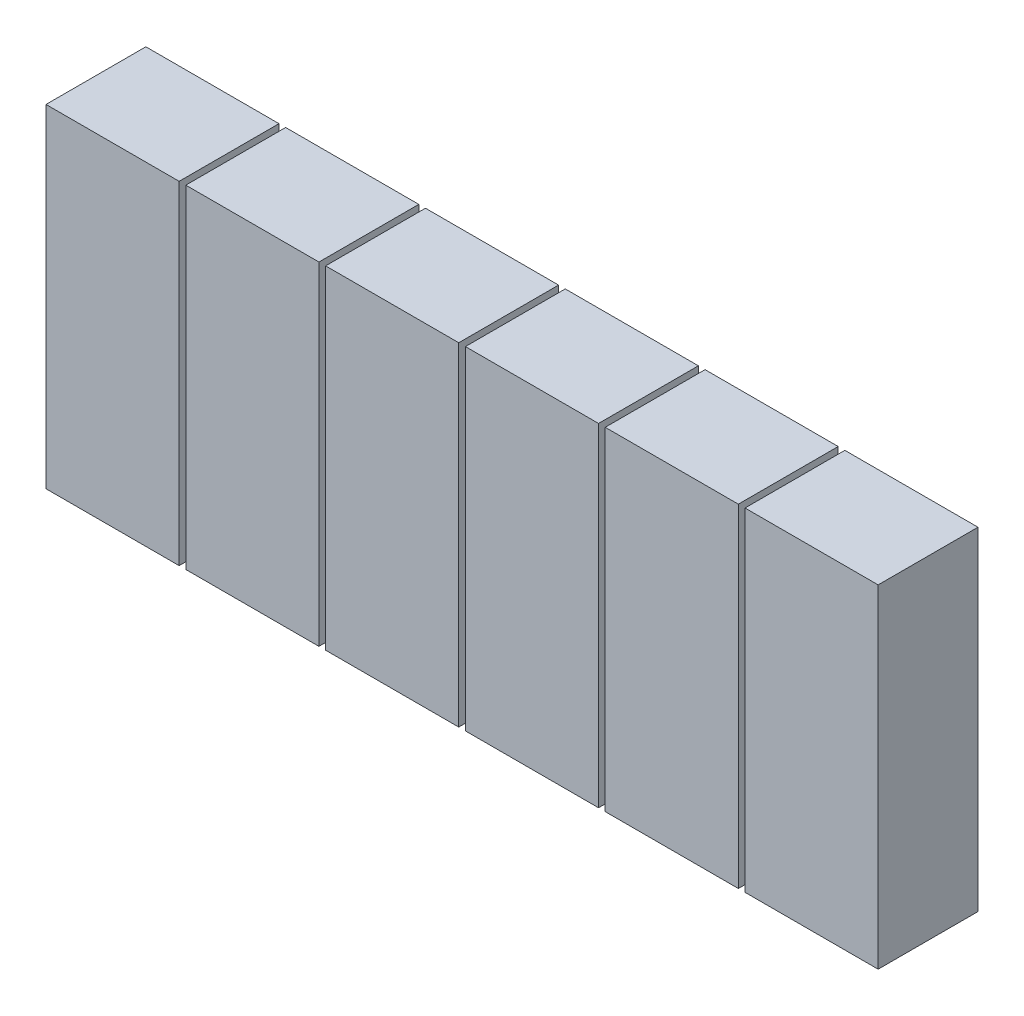
ISO-10303-21;
HEADER;
FILE_DESCRIPTION(('STEP AP214'),'2;1');
FILE_NAME('part.step','',(''),(''),'','','');
FILE_SCHEMA(('AUTOMOTIVE_DESIGN { 1 0 10303 214 1 1 1 1 }'));
ENDSEC;
DATA;
#1=APPLICATION_CONTEXT('core data for automotive mechanical design processes');
#2=APPLICATION_PROTOCOL_DEFINITION('international standard','automotive_design',2000,#1);
#3=PRODUCT_CONTEXT('',#1,'mechanical');
#4=PRODUCT('Part','Part','',(#3));
#5=PRODUCT_RELATED_PRODUCT_CATEGORY('part','',(#4));
#6=PRODUCT_DEFINITION_FORMATION('','',#4);
#7=PRODUCT_DEFINITION_CONTEXT('part definition',#1,'design');
#8=PRODUCT_DEFINITION('design','',#6,#7);
#9=PRODUCT_DEFINITION_SHAPE('','',#8);
#10=(LENGTH_UNIT() NAMED_UNIT(*) SI_UNIT(.MILLI.,.METRE.));
#11=(NAMED_UNIT(*) PLANE_ANGLE_UNIT() SI_UNIT($,.RADIAN.));
#12=(NAMED_UNIT(*) SI_UNIT($,.STERADIAN.) SOLID_ANGLE_UNIT());
#13=UNCERTAINTY_MEASURE_WITH_UNIT(LENGTH_MEASURE(1.E-05),#10,'distance_accuracy_value','');
#14=(GEOMETRIC_REPRESENTATION_CONTEXT(3) GLOBAL_UNCERTAINTY_ASSIGNED_CONTEXT((#13)) GLOBAL_UNIT_ASSIGNED_CONTEXT((#10,
#11,#12)) REPRESENTATION_CONTEXT('',''));
#15=CARTESIAN_POINT('',(0.,0.,0.));
#16=DIRECTION('',(0.,0.,1.));
#17=DIRECTION('',(1.,0.,0.));
#18=AXIS2_PLACEMENT_3D('',#15,#16,#17);
#19=CARTESIAN_POINT('',(9500.,-2500.,1500.));
#20=DIRECTION('',(0.,1.,0.));
#21=DIRECTION('',(0.,0.,1.));
#22=AXIS2_PLACEMENT_3D('',#19,#20,#21);
#23=PLANE('',#22);
#24=DIRECTION('',(1.,0.,0.));
#25=VECTOR('',#24,1.);
#26=CARTESIAN_POINT('',(9500.,-2500.,0.));
#27=LINE('',#26,#25);
#28=CARTESIAN_POINT('',(9500.,-2500.,0.));
#29=VERTEX_POINT('',#28);
#30=CARTESIAN_POINT('',(11500.,-2500.,0.));
#31=VERTEX_POINT('',#30);
#32=EDGE_CURVE('E113',#29,#31,#27,.T.);
#33=ORIENTED_EDGE('',*,*,#32,.T.);
#34=DIRECTION('',(0.,0.,-1.));
#35=VECTOR('',#34,1.);
#36=CARTESIAN_POINT('',(11500.,-2500.,1500.));
#37=LINE('',#36,#35);
#38=CARTESIAN_POINT('',(11500.,-2500.,1500.));
#39=VERTEX_POINT('',#38);
#40=EDGE_CURVE('E12',#39,#31,#37,.T.);
#41=ORIENTED_EDGE('',*,*,#40,.F.);
#42=DIRECTION('',(1.,0.,0.));
#43=VECTOR('',#42,1.);
#44=CARTESIAN_POINT('',(9500.,-2500.,1500.));
#45=LINE('',#44,#43);
#46=CARTESIAN_POINT('',(9500.,-2500.,1500.));
#47=VERTEX_POINT('',#46);
#48=EDGE_CURVE('E101',#47,#39,#45,.T.);
#49=ORIENTED_EDGE('',*,*,#48,.F.);
#50=DIRECTION('',(0.,0.,-1.));
#51=VECTOR('',#50,1.);
#52=CARTESIAN_POINT('',(9500.,-2500.,1500.));
#53=LINE('',#52,#51);
#54=EDGE_CURVE('E109',#47,#29,#53,.T.);
#55=ORIENTED_EDGE('',*,*,#54,.T.);
#56=EDGE_LOOP('',(#33,#41,#49,#55));
#57=FACE_BOUND('',#56,.T.);
#58=ADVANCED_FACE('F50',(#57),#23,.F.);
#59=CARTESIAN_POINT('',(11500.,2500.,1500.));
#60=DIRECTION('',(-1.,0.,0.));
#61=DIRECTION('',(0.,0.,1.));
#62=AXIS2_PLACEMENT_3D('',#59,#60,#61);
#63=PLANE('',#62);
#64=DIRECTION('',(0.,1.,0.));
#65=VECTOR('',#64,1.);
#66=CARTESIAN_POINT('',(11500.,2500.,0.));
#67=LINE('',#66,#65);
#68=CARTESIAN_POINT('',(11500.,2500.,0.));
#69=VERTEX_POINT('',#68);
#70=EDGE_CURVE('E105',#31,#69,#67,.T.);
#71=ORIENTED_EDGE('',*,*,#70,.T.);
#72=DIRECTION('',(0.,0.,-1.));
#73=VECTOR('',#72,1.);
#74=CARTESIAN_POINT('',(11500.,2500.,1500.));
#75=LINE('',#74,#73);
#76=CARTESIAN_POINT('',(11500.,2500.,1500.));
#77=VERTEX_POINT('',#76);
#78=EDGE_CURVE('E58',#77,#69,#75,.T.);
#79=ORIENTED_EDGE('',*,*,#78,.F.);
#80=DIRECTION('',(0.,1.,0.));
#81=VECTOR('',#80,1.);
#82=CARTESIAN_POINT('',(11500.,2500.,1500.));
#83=LINE('',#82,#81);
#84=EDGE_CURVE('E96',#39,#77,#83,.T.);
#85=ORIENTED_EDGE('',*,*,#84,.F.);
#86=ORIENTED_EDGE('',*,*,#40,.T.);
#87=EDGE_LOOP('',(#71,#79,#85,#86));
#88=FACE_BOUND('',#87,.T.);
#89=ADVANCED_FACE('F104',(#88),#63,.F.);
#90=CARTESIAN_POINT('',(9500.,2500.,1500.));
#91=DIRECTION('',(0.,-1.,0.));
#92=DIRECTION('',(0.,0.,-1.));
#93=AXIS2_PLACEMENT_3D('',#90,#91,#92);
#94=PLANE('',#93);
#95=DIRECTION('',(-1.,0.,0.));
#96=VECTOR('',#95,1.);
#97=CARTESIAN_POINT('',(9500.,2500.,0.));
#98=LINE('',#97,#96);
#99=CARTESIAN_POINT('',(9500.,2500.,0.));
#100=VERTEX_POINT('',#99);
#101=EDGE_CURVE('E83',#69,#100,#98,.T.);
#102=ORIENTED_EDGE('',*,*,#101,.T.);
#103=DIRECTION('',(0.,0.,-1.));
#104=VECTOR('',#103,1.);
#105=CARTESIAN_POINT('',(9500.,2500.,1500.));
#106=LINE('',#105,#104);
#107=CARTESIAN_POINT('',(9500.,2500.,1500.));
#108=VERTEX_POINT('',#107);
#109=EDGE_CURVE('E106',#108,#100,#106,.T.);
#110=ORIENTED_EDGE('',*,*,#109,.F.);
#111=DIRECTION('',(-1.,0.,0.));
#112=VECTOR('',#111,1.);
#113=CARTESIAN_POINT('',(9500.,2500.,1500.));
#114=LINE('',#113,#112);
#115=EDGE_CURVE('E99',#77,#108,#114,.T.);
#116=ORIENTED_EDGE('',*,*,#115,.F.);
#117=ORIENTED_EDGE('',*,*,#78,.T.);
#118=EDGE_LOOP('',(#102,#110,#116,#117));
#119=FACE_BOUND('',#118,.T.);
#120=ADVANCED_FACE('F107',(#119),#94,.F.);
#121=CARTESIAN_POINT('',(9500.,2500.,1500.));
#122=DIRECTION('',(1.,0.,0.));
#123=DIRECTION('',(0.,0.,-1.));
#124=AXIS2_PLACEMENT_3D('',#121,#122,#123);
#125=PLANE('',#124);
#126=DIRECTION('',(0.,-1.,0.));
#127=VECTOR('',#126,1.);
#128=CARTESIAN_POINT('',(9500.,2500.,0.));
#129=LINE('',#128,#127);
#130=EDGE_CURVE('E89',#100,#29,#129,.T.);
#131=ORIENTED_EDGE('',*,*,#130,.T.);
#132=ORIENTED_EDGE('',*,*,#54,.F.);
#133=DIRECTION('',(0.,-1.,0.));
#134=VECTOR('',#133,1.);
#135=CARTESIAN_POINT('',(9500.,2500.,1500.));
#136=LINE('',#135,#134);
#137=EDGE_CURVE('E66',#108,#47,#136,.T.);
#138=ORIENTED_EDGE('',*,*,#137,.F.);
#139=ORIENTED_EDGE('',*,*,#109,.T.);
#140=EDGE_LOOP('',(#131,#132,#138,#139));
#141=FACE_BOUND('',#140,.T.);
#142=ADVANCED_FACE('F120',(#141),#125,.F.);
#143=CARTESIAN_POINT('',(0.,0.,1500.));
#144=DIRECTION('',(0.,0.,-1.));
#145=DIRECTION('',(-1.,0.,0.));
#146=AXIS2_PLACEMENT_3D('',#143,#144,#145);
#147=PLANE('',#146);
#148=ORIENTED_EDGE('',*,*,#48,.T.);
#149=ORIENTED_EDGE('',*,*,#84,.T.);
#150=ORIENTED_EDGE('',*,*,#115,.T.);
#151=ORIENTED_EDGE('',*,*,#137,.T.);
#152=EDGE_LOOP('',(#148,#149,#150,#151));
#153=FACE_BOUND('',#152,.T.);
#154=ADVANCED_FACE('F97',(#153),#147,.F.);
#155=CARTESIAN_POINT('',(0.,0.,0.));
#156=DIRECTION('',(0.,0.,-1.));
#157=DIRECTION('',(-1.,0.,0.));
#158=AXIS2_PLACEMENT_3D('',#155,#156,#157);
#159=PLANE('',#158);
#160=ORIENTED_EDGE('',*,*,#32,.F.);
#161=ORIENTED_EDGE('',*,*,#130,.F.);
#162=ORIENTED_EDGE('',*,*,#101,.F.);
#163=ORIENTED_EDGE('',*,*,#70,.F.);
#164=EDGE_LOOP('',(#160,#161,#162,#163));
#165=FACE_BOUND('',#164,.T.);
#166=ADVANCED_FACE('F123',(#165),#159,.T.);
#167=CLOSED_SHELL('',(#58,#89,#120,#142,#154,#166));
#168=MANIFOLD_SOLID_BREP('B2',#167);
#169=CARTESIAN_POINT('',(7400.,-2500.,1500.));
#170=DIRECTION('',(0.,1.,0.));
#171=DIRECTION('',(0.,0.,1.));
#172=AXIS2_PLACEMENT_3D('',#169,#170,#171);
#173=PLANE('',#172);
#174=DIRECTION('',(1.,0.,0.));
#175=VECTOR('',#174,1.);
#176=CARTESIAN_POINT('',(7400.,-2500.,0.));
#177=LINE('',#176,#175);
#178=CARTESIAN_POINT('',(7400.,-2500.,0.));
#179=VERTEX_POINT('',#178);
#180=CARTESIAN_POINT('',(9400.,-2500.,0.));
#181=VERTEX_POINT('',#180);
#182=EDGE_CURVE('E247',#179,#181,#177,.T.);
#183=ORIENTED_EDGE('',*,*,#182,.T.);
#184=DIRECTION('',(0.,0.,-1.));
#185=VECTOR('',#184,1.);
#186=CARTESIAN_POINT('',(9400.,-2500.,1500.));
#187=LINE('',#186,#185);
#188=CARTESIAN_POINT('',(9400.,-2500.,1500.));
#189=VERTEX_POINT('',#188);
#190=EDGE_CURVE('E48',#189,#181,#187,.T.);
#191=ORIENTED_EDGE('',*,*,#190,.F.);
#192=DIRECTION('',(1.,0.,0.));
#193=VECTOR('',#192,1.);
#194=CARTESIAN_POINT('',(7400.,-2500.,1500.));
#195=LINE('',#194,#193);
#196=CARTESIAN_POINT('',(7400.,-2500.,1500.));
#197=VERTEX_POINT('',#196);
#198=EDGE_CURVE('E235',#197,#189,#195,.T.);
#199=ORIENTED_EDGE('',*,*,#198,.F.);
#200=DIRECTION('',(0.,0.,-1.));
#201=VECTOR('',#200,1.);
#202=CARTESIAN_POINT('',(7400.,-2500.,1500.));
#203=LINE('',#202,#201);
#204=EDGE_CURVE('E243',#197,#179,#203,.T.);
#205=ORIENTED_EDGE('',*,*,#204,.T.);
#206=EDGE_LOOP('',(#183,#191,#199,#205));
#207=FACE_BOUND('',#206,.T.);
#208=ADVANCED_FACE('F184',(#207),#173,.F.);
#209=CARTESIAN_POINT('',(9400.,2500.,1500.));
#210=DIRECTION('',(-1.,0.,0.));
#211=DIRECTION('',(0.,0.,1.));
#212=AXIS2_PLACEMENT_3D('',#209,#210,#211);
#213=PLANE('',#212);
#214=DIRECTION('',(0.,1.,0.));
#215=VECTOR('',#214,1.);
#216=CARTESIAN_POINT('',(9400.,2500.,0.));
#217=LINE('',#216,#215);
#218=CARTESIAN_POINT('',(9400.,2500.,0.));
#219=VERTEX_POINT('',#218);
#220=EDGE_CURVE('E239',#181,#219,#217,.T.);
#221=ORIENTED_EDGE('',*,*,#220,.T.);
#222=DIRECTION('',(0.,0.,-1.));
#223=VECTOR('',#222,1.);
#224=CARTESIAN_POINT('',(9400.,2500.,1500.));
#225=LINE('',#224,#223);
#226=CARTESIAN_POINT('',(9400.,2500.,1500.));
#227=VERTEX_POINT('',#226);
#228=EDGE_CURVE('E192',#227,#219,#225,.T.);
#229=ORIENTED_EDGE('',*,*,#228,.F.);
#230=DIRECTION('',(0.,1.,0.));
#231=VECTOR('',#230,1.);
#232=CARTESIAN_POINT('',(9400.,2500.,1500.));
#233=LINE('',#232,#231);
#234=EDGE_CURVE('E230',#189,#227,#233,.T.);
#235=ORIENTED_EDGE('',*,*,#234,.F.);
#236=ORIENTED_EDGE('',*,*,#190,.T.);
#237=EDGE_LOOP('',(#221,#229,#235,#236));
#238=FACE_BOUND('',#237,.T.);
#239=ADVANCED_FACE('F238',(#238),#213,.F.);
#240=CARTESIAN_POINT('',(7400.,2500.,1500.));
#241=DIRECTION('',(0.,-1.,0.));
#242=DIRECTION('',(0.,0.,-1.));
#243=AXIS2_PLACEMENT_3D('',#240,#241,#242);
#244=PLANE('',#243);
#245=DIRECTION('',(-1.,0.,0.));
#246=VECTOR('',#245,1.);
#247=CARTESIAN_POINT('',(7400.,2500.,0.));
#248=LINE('',#247,#246);
#249=CARTESIAN_POINT('',(7400.,2500.,0.));
#250=VERTEX_POINT('',#249);
#251=EDGE_CURVE('E217',#219,#250,#248,.T.);
#252=ORIENTED_EDGE('',*,*,#251,.T.);
#253=DIRECTION('',(0.,0.,-1.));
#254=VECTOR('',#253,1.);
#255=CARTESIAN_POINT('',(7400.,2500.,1500.));
#256=LINE('',#255,#254);
#257=CARTESIAN_POINT('',(7400.,2500.,1500.));
#258=VERTEX_POINT('',#257);
#259=EDGE_CURVE('E240',#258,#250,#256,.T.);
#260=ORIENTED_EDGE('',*,*,#259,.F.);
#261=DIRECTION('',(-1.,0.,0.));
#262=VECTOR('',#261,1.);
#263=CARTESIAN_POINT('',(7400.,2500.,1500.));
#264=LINE('',#263,#262);
#265=EDGE_CURVE('E233',#227,#258,#264,.T.);
#266=ORIENTED_EDGE('',*,*,#265,.F.);
#267=ORIENTED_EDGE('',*,*,#228,.T.);
#268=EDGE_LOOP('',(#252,#260,#266,#267));
#269=FACE_BOUND('',#268,.T.);
#270=ADVANCED_FACE('F241',(#269),#244,.F.);
#271=CARTESIAN_POINT('',(7400.,2500.,1500.));
#272=DIRECTION('',(1.,0.,0.));
#273=DIRECTION('',(0.,1.,0.));
#274=AXIS2_PLACEMENT_3D('',#271,#272,#273);
#275=PLANE('',#274);
#276=DIRECTION('',(0.,-1.,0.));
#277=VECTOR('',#276,1.);
#278=CARTESIAN_POINT('',(7400.,2500.,0.));
#279=LINE('',#278,#277);
#280=EDGE_CURVE('E223',#250,#179,#279,.T.);
#281=ORIENTED_EDGE('',*,*,#280,.T.);
#282=ORIENTED_EDGE('',*,*,#204,.F.);
#283=DIRECTION('',(0.,-1.,0.));
#284=VECTOR('',#283,1.);
#285=CARTESIAN_POINT('',(7400.,2500.,1500.));
#286=LINE('',#285,#284);
#287=EDGE_CURVE('E200',#258,#197,#286,.T.);
#288=ORIENTED_EDGE('',*,*,#287,.F.);
#289=ORIENTED_EDGE('',*,*,#259,.T.);
#290=EDGE_LOOP('',(#281,#282,#288,#289));
#291=FACE_BOUND('',#290,.T.);
#292=ADVANCED_FACE('F254',(#291),#275,.F.);
#293=CARTESIAN_POINT('',(0.,0.,1500.));
#294=DIRECTION('',(0.,0.,-1.));
#295=DIRECTION('',(-1.,0.,0.));
#296=AXIS2_PLACEMENT_3D('',#293,#294,#295);
#297=PLANE('',#296);
#298=ORIENTED_EDGE('',*,*,#198,.T.);
#299=ORIENTED_EDGE('',*,*,#234,.T.);
#300=ORIENTED_EDGE('',*,*,#265,.T.);
#301=ORIENTED_EDGE('',*,*,#287,.T.);
#302=EDGE_LOOP('',(#298,#299,#300,#301));
#303=FACE_BOUND('',#302,.T.);
#304=ADVANCED_FACE('F231',(#303),#297,.F.);
#305=CARTESIAN_POINT('',(0.,0.,0.));
#306=DIRECTION('',(0.,0.,-1.));
#307=DIRECTION('',(-1.,0.,0.));
#308=AXIS2_PLACEMENT_3D('',#305,#306,#307);
#309=PLANE('',#308);
#310=ORIENTED_EDGE('',*,*,#182,.F.);
#311=ORIENTED_EDGE('',*,*,#280,.F.);
#312=ORIENTED_EDGE('',*,*,#251,.F.);
#313=ORIENTED_EDGE('',*,*,#220,.F.);
#314=EDGE_LOOP('',(#310,#311,#312,#313));
#315=FACE_BOUND('',#314,.T.);
#316=ADVANCED_FACE('F257',(#315),#309,.T.);
#317=CLOSED_SHELL('',(#208,#239,#270,#292,#304,#316));
#318=MANIFOLD_SOLID_BREP('B6',#317);
#319=CARTESIAN_POINT('',(5300.,-2500.,1500.));
#320=DIRECTION('',(0.,1.,0.));
#321=DIRECTION('',(0.,0.,1.));
#322=AXIS2_PLACEMENT_3D('',#319,#320,#321);
#323=PLANE('',#322);
#324=DIRECTION('',(1.,0.,0.));
#325=VECTOR('',#324,1.);
#326=CARTESIAN_POINT('',(5300.,-2500.,0.));
#327=LINE('',#326,#325);
#328=CARTESIAN_POINT('',(5300.,-2500.,0.));
#329=VERTEX_POINT('',#328);
#330=CARTESIAN_POINT('',(7300.,-2500.,0.));
#331=VERTEX_POINT('',#330);
#332=EDGE_CURVE('E381',#329,#331,#327,.T.);
#333=ORIENTED_EDGE('',*,*,#332,.T.);
#334=DIRECTION('',(0.,0.,-1.));
#335=VECTOR('',#334,1.);
#336=CARTESIAN_POINT('',(7300.,-2500.,1500.));
#337=LINE('',#336,#335);
#338=CARTESIAN_POINT('',(7300.,-2500.,1500.));
#339=VERTEX_POINT('',#338);
#340=EDGE_CURVE('E182',#339,#331,#337,.T.);
#341=ORIENTED_EDGE('',*,*,#340,.F.);
#342=DIRECTION('',(1.,0.,0.));
#343=VECTOR('',#342,1.);
#344=CARTESIAN_POINT('',(5300.,-2500.,1500.));
#345=LINE('',#344,#343);
#346=CARTESIAN_POINT('',(5300.,-2500.,1500.));
#347=VERTEX_POINT('',#346);
#348=EDGE_CURVE('E369',#347,#339,#345,.T.);
#349=ORIENTED_EDGE('',*,*,#348,.F.);
#350=DIRECTION('',(0.,0.,-1.));
#351=VECTOR('',#350,1.);
#352=CARTESIAN_POINT('',(5300.,-2500.,1500.));
#353=LINE('',#352,#351);
#354=EDGE_CURVE('E377',#347,#329,#353,.T.);
#355=ORIENTED_EDGE('',*,*,#354,.T.);
#356=EDGE_LOOP('',(#333,#341,#349,#355));
#357=FACE_BOUND('',#356,.T.);
#358=ADVANCED_FACE('F318',(#357),#323,.F.);
#359=CARTESIAN_POINT('',(7300.,2500.,1500.));
#360=DIRECTION('',(-1.,0.,0.));
#361=DIRECTION('',(0.,0.,1.));
#362=AXIS2_PLACEMENT_3D('',#359,#360,#361);
#363=PLANE('',#362);
#364=DIRECTION('',(0.,1.,0.));
#365=VECTOR('',#364,1.);
#366=CARTESIAN_POINT('',(7300.,2500.,0.));
#367=LINE('',#366,#365);
#368=CARTESIAN_POINT('',(7300.,2500.,0.));
#369=VERTEX_POINT('',#368);
#370=EDGE_CURVE('E373',#331,#369,#367,.T.);
#371=ORIENTED_EDGE('',*,*,#370,.T.);
#372=DIRECTION('',(0.,0.,-1.));
#373=VECTOR('',#372,1.);
#374=CARTESIAN_POINT('',(7300.,2500.,1500.));
#375=LINE('',#374,#373);
#376=CARTESIAN_POINT('',(7300.,2500.,1500.));
#377=VERTEX_POINT('',#376);
#378=EDGE_CURVE('E326',#377,#369,#375,.T.);
#379=ORIENTED_EDGE('',*,*,#378,.F.);
#380=DIRECTION('',(0.,1.,0.));
#381=VECTOR('',#380,1.);
#382=CARTESIAN_POINT('',(7300.,2500.,1500.));
#383=LINE('',#382,#381);
#384=EDGE_CURVE('E364',#339,#377,#383,.T.);
#385=ORIENTED_EDGE('',*,*,#384,.F.);
#386=ORIENTED_EDGE('',*,*,#340,.T.);
#387=EDGE_LOOP('',(#371,#379,#385,#386));
#388=FACE_BOUND('',#387,.T.);
#389=ADVANCED_FACE('F372',(#388),#363,.F.);
#390=CARTESIAN_POINT('',(5300.,2500.,1500.));
#391=DIRECTION('',(0.,-1.,0.));
#392=DIRECTION('',(0.,0.,-1.));
#393=AXIS2_PLACEMENT_3D('',#390,#391,#392);
#394=PLANE('',#393);
#395=DIRECTION('',(-1.,0.,0.));
#396=VECTOR('',#395,1.);
#397=CARTESIAN_POINT('',(5300.,2500.,0.));
#398=LINE('',#397,#396);
#399=CARTESIAN_POINT('',(5300.,2500.,0.));
#400=VERTEX_POINT('',#399);
#401=EDGE_CURVE('E351',#369,#400,#398,.T.);
#402=ORIENTED_EDGE('',*,*,#401,.T.);
#403=DIRECTION('',(0.,0.,-1.));
#404=VECTOR('',#403,1.);
#405=CARTESIAN_POINT('',(5300.,2500.,1500.));
#406=LINE('',#405,#404);
#407=CARTESIAN_POINT('',(5300.,2500.,1500.));
#408=VERTEX_POINT('',#407);
#409=EDGE_CURVE('E374',#408,#400,#406,.T.);
#410=ORIENTED_EDGE('',*,*,#409,.F.);
#411=DIRECTION('',(-1.,0.,0.));
#412=VECTOR('',#411,1.);
#413=CARTESIAN_POINT('',(5300.,2500.,1500.));
#414=LINE('',#413,#412);
#415=EDGE_CURVE('E367',#377,#408,#414,.T.);
#416=ORIENTED_EDGE('',*,*,#415,.F.);
#417=ORIENTED_EDGE('',*,*,#378,.T.);
#418=EDGE_LOOP('',(#402,#410,#416,#417));
#419=FACE_BOUND('',#418,.T.);
#420=ADVANCED_FACE('F375',(#419),#394,.F.);
#421=CARTESIAN_POINT('',(5300.,2500.,1500.));
#422=DIRECTION('',(1.,0.,0.));
#423=DIRECTION('',(0.,1.,0.));
#424=AXIS2_PLACEMENT_3D('',#421,#422,#423);
#425=PLANE('',#424);
#426=DIRECTION('',(0.,-1.,0.));
#427=VECTOR('',#426,1.);
#428=CARTESIAN_POINT('',(5300.,2500.,0.));
#429=LINE('',#428,#427);
#430=EDGE_CURVE('E357',#400,#329,#429,.T.);
#431=ORIENTED_EDGE('',*,*,#430,.T.);
#432=ORIENTED_EDGE('',*,*,#354,.F.);
#433=DIRECTION('',(0.,-1.,0.));
#434=VECTOR('',#433,1.);
#435=CARTESIAN_POINT('',(5300.,2500.,1500.));
#436=LINE('',#435,#434);
#437=EDGE_CURVE('E334',#408,#347,#436,.T.);
#438=ORIENTED_EDGE('',*,*,#437,.F.);
#439=ORIENTED_EDGE('',*,*,#409,.T.);
#440=EDGE_LOOP('',(#431,#432,#438,#439));
#441=FACE_BOUND('',#440,.T.);
#442=ADVANCED_FACE('F388',(#441),#425,.F.);
#443=CARTESIAN_POINT('',(0.,0.,1500.));
#444=DIRECTION('',(0.,0.,-1.));
#445=DIRECTION('',(-1.,0.,0.));
#446=AXIS2_PLACEMENT_3D('',#443,#444,#445);
#447=PLANE('',#446);
#448=ORIENTED_EDGE('',*,*,#348,.T.);
#449=ORIENTED_EDGE('',*,*,#384,.T.);
#450=ORIENTED_EDGE('',*,*,#415,.T.);
#451=ORIENTED_EDGE('',*,*,#437,.T.);
#452=EDGE_LOOP('',(#448,#449,#450,#451));
#453=FACE_BOUND('',#452,.T.);
#454=ADVANCED_FACE('F365',(#453),#447,.F.);
#455=CARTESIAN_POINT('',(0.,0.,0.));
#456=DIRECTION('',(0.,0.,-1.));
#457=DIRECTION('',(-1.,0.,0.));
#458=AXIS2_PLACEMENT_3D('',#455,#456,#457);
#459=PLANE('',#458);
#460=ORIENTED_EDGE('',*,*,#332,.F.);
#461=ORIENTED_EDGE('',*,*,#430,.F.);
#462=ORIENTED_EDGE('',*,*,#401,.F.);
#463=ORIENTED_EDGE('',*,*,#370,.F.);
#464=EDGE_LOOP('',(#460,#461,#462,#463));
#465=FACE_BOUND('',#464,.T.);
#466=ADVANCED_FACE('F391',(#465),#459,.T.);
#467=CLOSED_SHELL('',(#358,#389,#420,#442,#454,#466));
#468=MANIFOLD_SOLID_BREP('B42',#467);
#469=CARTESIAN_POINT('',(3200.,-2500.,1500.));
#470=DIRECTION('',(0.,1.,0.));
#471=DIRECTION('',(0.,0.,1.));
#472=AXIS2_PLACEMENT_3D('',#469,#470,#471);
#473=PLANE('',#472);
#474=DIRECTION('',(1.,0.,0.));
#475=VECTOR('',#474,1.);
#476=CARTESIAN_POINT('',(3200.,-2500.,0.));
#477=LINE('',#476,#475);
#478=CARTESIAN_POINT('',(3200.,-2500.,0.));
#479=VERTEX_POINT('',#478);
#480=CARTESIAN_POINT('',(5200.,-2500.,0.));
#481=VERTEX_POINT('',#480);
#482=EDGE_CURVE('E515',#479,#481,#477,.T.);
#483=ORIENTED_EDGE('',*,*,#482,.T.);
#484=DIRECTION('',(0.,0.,-1.));
#485=VECTOR('',#484,1.);
#486=CARTESIAN_POINT('',(5200.,-2500.,1500.));
#487=LINE('',#486,#485);
#488=CARTESIAN_POINT('',(5200.,-2500.,1500.));
#489=VERTEX_POINT('',#488);
#490=EDGE_CURVE('E316',#489,#481,#487,.T.);
#491=ORIENTED_EDGE('',*,*,#490,.F.);
#492=DIRECTION('',(1.,0.,0.));
#493=VECTOR('',#492,1.);
#494=CARTESIAN_POINT('',(3200.,-2500.,1500.));
#495=LINE('',#494,#493);
#496=CARTESIAN_POINT('',(3200.,-2500.,1500.));
#497=VERTEX_POINT('',#496);
#498=EDGE_CURVE('E503',#497,#489,#495,.T.);
#499=ORIENTED_EDGE('',*,*,#498,.F.);
#500=DIRECTION('',(0.,0.,-1.));
#501=VECTOR('',#500,1.);
#502=CARTESIAN_POINT('',(3200.,-2500.,1500.));
#503=LINE('',#502,#501);
#504=EDGE_CURVE('E511',#497,#479,#503,.T.);
#505=ORIENTED_EDGE('',*,*,#504,.T.);
#506=EDGE_LOOP('',(#483,#491,#499,#505));
#507=FACE_BOUND('',#506,.T.);
#508=ADVANCED_FACE('F452',(#507),#473,.F.);
#509=CARTESIAN_POINT('',(5200.,2500.,1500.));
#510=DIRECTION('',(-1.,0.,0.));
#511=DIRECTION('',(0.,-1.,0.));
#512=AXIS2_PLACEMENT_3D('',#509,#510,#511);
#513=PLANE('',#512);
#514=DIRECTION('',(0.,1.,0.));
#515=VECTOR('',#514,1.);
#516=CARTESIAN_POINT('',(5200.,2500.,0.));
#517=LINE('',#516,#515);
#518=CARTESIAN_POINT('',(5200.,2500.,0.));
#519=VERTEX_POINT('',#518);
#520=EDGE_CURVE('E507',#481,#519,#517,.T.);
#521=ORIENTED_EDGE('',*,*,#520,.T.);
#522=DIRECTION('',(0.,0.,-1.));
#523=VECTOR('',#522,1.);
#524=CARTESIAN_POINT('',(5200.,2500.,1500.));
#525=LINE('',#524,#523);
#526=CARTESIAN_POINT('',(5200.,2500.,1500.));
#527=VERTEX_POINT('',#526);
#528=EDGE_CURVE('E460',#527,#519,#525,.T.);
#529=ORIENTED_EDGE('',*,*,#528,.F.);
#530=DIRECTION('',(0.,1.,0.));
#531=VECTOR('',#530,1.);
#532=CARTESIAN_POINT('',(5200.,2500.,1500.));
#533=LINE('',#532,#531);
#534=EDGE_CURVE('E498',#489,#527,#533,.T.);
#535=ORIENTED_EDGE('',*,*,#534,.F.);
#536=ORIENTED_EDGE('',*,*,#490,.T.);
#537=EDGE_LOOP('',(#521,#529,#535,#536));
#538=FACE_BOUND('',#537,.T.);
#539=ADVANCED_FACE('F506',(#538),#513,.F.);
#540=CARTESIAN_POINT('',(3200.,2500.,1500.));
#541=DIRECTION('',(0.,-1.,0.));
#542=DIRECTION('',(0.,0.,-1.));
#543=AXIS2_PLACEMENT_3D('',#540,#541,#542);
#544=PLANE('',#543);
#545=DIRECTION('',(-1.,0.,0.));
#546=VECTOR('',#545,1.);
#547=CARTESIAN_POINT('',(3200.,2500.,0.));
#548=LINE('',#547,#546);
#549=CARTESIAN_POINT('',(3200.,2500.,0.));
#550=VERTEX_POINT('',#549);
#551=EDGE_CURVE('E485',#519,#550,#548,.T.);
#552=ORIENTED_EDGE('',*,*,#551,.T.);
#553=DIRECTION('',(0.,0.,-1.));
#554=VECTOR('',#553,1.);
#555=CARTESIAN_POINT('',(3200.,2500.,1500.));
#556=LINE('',#555,#554);
#557=CARTESIAN_POINT('',(3200.,2500.,1500.));
#558=VERTEX_POINT('',#557);
#559=EDGE_CURVE('E508',#558,#550,#556,.T.);
#560=ORIENTED_EDGE('',*,*,#559,.F.);
#561=DIRECTION('',(-1.,0.,0.));
#562=VECTOR('',#561,1.);
#563=CARTESIAN_POINT('',(3200.,2500.,1500.));
#564=LINE('',#563,#562);
#565=EDGE_CURVE('E501',#527,#558,#564,.T.);
#566=ORIENTED_EDGE('',*,*,#565,.F.);
#567=ORIENTED_EDGE('',*,*,#528,.T.);
#568=EDGE_LOOP('',(#552,#560,#566,#567));
#569=FACE_BOUND('',#568,.T.);
#570=ADVANCED_FACE('F509',(#569),#544,.F.);
#571=CARTESIAN_POINT('',(3200.,2500.,1500.));
#572=DIRECTION('',(1.,0.,0.));
#573=DIRECTION('',(0.,1.,0.));
#574=AXIS2_PLACEMENT_3D('',#571,#572,#573);
#575=PLANE('',#574);
#576=DIRECTION('',(0.,-1.,0.));
#577=VECTOR('',#576,1.);
#578=CARTESIAN_POINT('',(3200.,2500.,0.));
#579=LINE('',#578,#577);
#580=EDGE_CURVE('E491',#550,#479,#579,.T.);
#581=ORIENTED_EDGE('',*,*,#580,.T.);
#582=ORIENTED_EDGE('',*,*,#504,.F.);
#583=DIRECTION('',(0.,-1.,0.));
#584=VECTOR('',#583,1.);
#585=CARTESIAN_POINT('',(3200.,2500.,1500.));
#586=LINE('',#585,#584);
#587=EDGE_CURVE('E468',#558,#497,#586,.T.);
#588=ORIENTED_EDGE('',*,*,#587,.F.);
#589=ORIENTED_EDGE('',*,*,#559,.T.);
#590=EDGE_LOOP('',(#581,#582,#588,#589));
#591=FACE_BOUND('',#590,.T.);
#592=ADVANCED_FACE('F522',(#591),#575,.F.);
#593=CARTESIAN_POINT('',(0.,0.,1500.));
#594=DIRECTION('',(0.,0.,-1.));
#595=DIRECTION('',(-1.,0.,0.));
#596=AXIS2_PLACEMENT_3D('',#593,#594,#595);
#597=PLANE('',#596);
#598=ORIENTED_EDGE('',*,*,#498,.T.);
#599=ORIENTED_EDGE('',*,*,#534,.T.);
#600=ORIENTED_EDGE('',*,*,#565,.T.);
#601=ORIENTED_EDGE('',*,*,#587,.T.);
#602=EDGE_LOOP('',(#598,#599,#600,#601));
#603=FACE_BOUND('',#602,.T.);
#604=ADVANCED_FACE('F499',(#603),#597,.F.);
#605=CARTESIAN_POINT('',(0.,0.,0.));
#606=DIRECTION('',(0.,0.,-1.));
#607=DIRECTION('',(-1.,0.,0.));
#608=AXIS2_PLACEMENT_3D('',#605,#606,#607);
#609=PLANE('',#608);
#610=ORIENTED_EDGE('',*,*,#482,.F.);
#611=ORIENTED_EDGE('',*,*,#580,.F.);
#612=ORIENTED_EDGE('',*,*,#551,.F.);
#613=ORIENTED_EDGE('',*,*,#520,.F.);
#614=EDGE_LOOP('',(#610,#611,#612,#613));
#615=FACE_BOUND('',#614,.T.);
#616=ADVANCED_FACE('F525',(#615),#609,.T.);
#617=CLOSED_SHELL('',(#508,#539,#570,#592,#604,#616));
#618=MANIFOLD_SOLID_BREP('B176',#617);
#619=CARTESIAN_POINT('',(1100.,-2500.,1500.));
#620=DIRECTION('',(0.,1.,0.));
#621=DIRECTION('',(0.,0.,1.));
#622=AXIS2_PLACEMENT_3D('',#619,#620,#621);
#623=PLANE('',#622);
#624=DIRECTION('',(1.,0.,0.));
#625=VECTOR('',#624,1.);
#626=CARTESIAN_POINT('',(1100.,-2500.,0.));
#627=LINE('',#626,#625);
#628=CARTESIAN_POINT('',(1100.,-2500.,0.));
#629=VERTEX_POINT('',#628);
#630=CARTESIAN_POINT('',(3100.,-2500.,0.));
#631=VERTEX_POINT('',#630);
#632=EDGE_CURVE('E653',#629,#631,#627,.T.);
#633=ORIENTED_EDGE('',*,*,#632,.T.);
#634=DIRECTION('',(0.,0.,-1.));
#635=VECTOR('',#634,1.);
#636=CARTESIAN_POINT('',(3100.,-2500.,1500.));
#637=LINE('',#636,#635);
#638=CARTESIAN_POINT('',(3100.,-2500.,1500.));
#639=VERTEX_POINT('',#638);
#640=EDGE_CURVE('E450',#639,#631,#637,.T.);
#641=ORIENTED_EDGE('',*,*,#640,.F.);
#642=DIRECTION('',(1.,0.,0.));
#643=VECTOR('',#642,1.);
#644=CARTESIAN_POINT('',(1100.,-2500.,1500.));
#645=LINE('',#644,#643);
#646=CARTESIAN_POINT('',(1100.,-2500.,1500.));
#647=VERTEX_POINT('',#646);
#648=EDGE_CURVE('E637',#647,#639,#645,.T.);
#649=ORIENTED_EDGE('',*,*,#648,.F.);
#650=DIRECTION('',(0.,0.,-1.));
#651=VECTOR('',#650,1.);
#652=CARTESIAN_POINT('',(1100.,-2500.,1500.));
#653=LINE('',#652,#651);
#654=EDGE_CURVE('E649',#647,#629,#653,.T.);
#655=ORIENTED_EDGE('',*,*,#654,.T.);
#656=EDGE_LOOP('',(#633,#641,#649,#655));
#657=FACE_BOUND('',#656,.T.);
#658=ADVANCED_FACE('F585',(#657),#623,.F.);
#659=CARTESIAN_POINT('',(3100.,2500.,1500.));
#660=DIRECTION('',(-1.,0.,0.));
#661=DIRECTION('',(0.,-1.,0.));
#662=AXIS2_PLACEMENT_3D('',#659,#660,#661);
#663=PLANE('',#662);
#664=DIRECTION('',(0.,1.,0.));
#665=VECTOR('',#664,1.);
#666=CARTESIAN_POINT('',(3100.,2500.,0.));
#667=LINE('',#666,#665);
#668=CARTESIAN_POINT('',(3100.,2500.,0.));
#669=VERTEX_POINT('',#668);
#670=EDGE_CURVE('E642',#631,#669,#667,.T.);
#671=ORIENTED_EDGE('',*,*,#670,.T.);
#672=DIRECTION('',(0.,0.,-1.));
#673=VECTOR('',#672,1.);
#674=CARTESIAN_POINT('',(3100.,2500.,1500.));
#675=LINE('',#674,#673);
#676=CARTESIAN_POINT('',(3100.,2500.,1500.));
#677=VERTEX_POINT('',#676);
#678=EDGE_CURVE('E594',#677,#669,#675,.T.);
#679=ORIENTED_EDGE('',*,*,#678,.F.);
#680=DIRECTION('',(0.,1.,0.));
#681=VECTOR('',#680,1.);
#682=CARTESIAN_POINT('',(3100.,2500.,1500.));
#683=LINE('',#682,#681);
#684=EDGE_CURVE('E632',#639,#677,#683,.T.);
#685=ORIENTED_EDGE('',*,*,#684,.F.);
#686=ORIENTED_EDGE('',*,*,#640,.T.);
#687=EDGE_LOOP('',(#671,#679,#685,#686));
#688=FACE_BOUND('',#687,.T.);
#689=ADVANCED_FACE('F641',(#688),#663,.F.);
#690=CARTESIAN_POINT('',(1100.,2500.,1500.));
#691=DIRECTION('',(0.,-1.,0.));
#692=DIRECTION('',(0.,0.,-1.));
#693=AXIS2_PLACEMENT_3D('',#690,#691,#692);
#694=PLANE('',#693);
#695=DIRECTION('',(-1.,0.,0.));
#696=VECTOR('',#695,1.);
#697=CARTESIAN_POINT('',(1100.,2500.,0.));
#698=LINE('',#697,#696);
#699=CARTESIAN_POINT('',(1100.,2500.,0.));
#700=VERTEX_POINT('',#699);
#701=EDGE_CURVE('E619',#669,#700,#698,.T.);
#702=ORIENTED_EDGE('',*,*,#701,.T.);
#703=DIRECTION('',(0.,0.,-1.));
#704=VECTOR('',#703,1.);
#705=CARTESIAN_POINT('',(1100.,2500.,1500.));
#706=LINE('',#705,#704);
#707=CARTESIAN_POINT('',(1100.,2500.,1500.));
#708=VERTEX_POINT('',#707);
#709=EDGE_CURVE('E644',#708,#700,#706,.T.);
#710=ORIENTED_EDGE('',*,*,#709,.F.);
#711=DIRECTION('',(-1.,0.,0.));
#712=VECTOR('',#711,1.);
#713=CARTESIAN_POINT('',(1100.,2500.,1500.));
#714=LINE('',#713,#712);
#715=EDGE_CURVE('E635',#677,#708,#714,.T.);
#716=ORIENTED_EDGE('',*,*,#715,.F.);
#717=ORIENTED_EDGE('',*,*,#678,.T.);
#718=EDGE_LOOP('',(#702,#710,#716,#717));
#719=FACE_BOUND('',#718,.T.);
#720=ADVANCED_FACE('F645',(#719),#694,.F.);
#721=CARTESIAN_POINT('',(1100.,2500.,1500.));
#722=DIRECTION('',(1.,0.,0.));
#723=DIRECTION('',(0.,1.,0.));
#724=AXIS2_PLACEMENT_3D('',#721,#722,#723);
#725=PLANE('',#724);
#726=DIRECTION('',(0.,-1.,0.));
#727=VECTOR('',#726,1.);
#728=CARTESIAN_POINT('',(1100.,2500.,0.));
#729=LINE('',#728,#727);
#730=EDGE_CURVE('E625',#700,#629,#729,.T.);
#731=ORIENTED_EDGE('',*,*,#730,.T.);
#732=ORIENTED_EDGE('',*,*,#654,.F.);
#733=DIRECTION('',(0.,-1.,0.));
#734=VECTOR('',#733,1.);
#735=CARTESIAN_POINT('',(1100.,2500.,1500.));
#736=LINE('',#735,#734);
#737=EDGE_CURVE('E602',#708,#647,#736,.T.);
#738=ORIENTED_EDGE('',*,*,#737,.F.);
#739=ORIENTED_EDGE('',*,*,#709,.T.);
#740=EDGE_LOOP('',(#731,#732,#738,#739));
#741=FACE_BOUND('',#740,.T.);
#742=ADVANCED_FACE('F666',(#741),#725,.F.);
#743=CARTESIAN_POINT('',(0.,0.,1500.));
#744=DIRECTION('',(0.,0.,-1.));
#745=DIRECTION('',(-1.,0.,0.));
#746=AXIS2_PLACEMENT_3D('',#743,#744,#745);
#747=PLANE('',#746);
#748=ORIENTED_EDGE('',*,*,#648,.T.);
#749=ORIENTED_EDGE('',*,*,#684,.T.);
#750=ORIENTED_EDGE('',*,*,#715,.T.);
#751=ORIENTED_EDGE('',*,*,#737,.T.);
#752=EDGE_LOOP('',(#748,#749,#750,#751));
#753=FACE_BOUND('',#752,.T.);
#754=ADVANCED_FACE('F633',(#753),#747,.F.);
#755=CARTESIAN_POINT('',(0.,0.,0.));
#756=DIRECTION('',(0.,0.,-1.));
#757=DIRECTION('',(-1.,0.,0.));
#758=AXIS2_PLACEMENT_3D('',#755,#756,#757);
#759=PLANE('',#758);
#760=ORIENTED_EDGE('',*,*,#632,.F.);
#761=ORIENTED_EDGE('',*,*,#730,.F.);
#762=ORIENTED_EDGE('',*,*,#701,.F.);
#763=ORIENTED_EDGE('',*,*,#670,.F.);
#764=EDGE_LOOP('',(#760,#761,#762,#763));
#765=FACE_BOUND('',#764,.T.);
#766=ADVANCED_FACE('F669',(#765),#759,.T.);
#767=CLOSED_SHELL('',(#658,#689,#720,#742,#754,#766));
#768=MANIFOLD_SOLID_BREP('B310',#767);
#769=CARTESIAN_POINT('',(1000.,2500.,1500.));
#770=DIRECTION('',(-1.,0.,0.));
#771=DIRECTION('',(0.,-1.,0.));
#772=AXIS2_PLACEMENT_3D('',#769,#770,#771);
#773=PLANE('',#772);
#774=DIRECTION('',(0.,1.,0.));
#775=VECTOR('',#774,1.);
#776=CARTESIAN_POINT('',(1000.,2500.,0.));
#777=LINE('',#776,#775);
#778=CARTESIAN_POINT('',(1000.,-2500.,0.));
#779=VERTEX_POINT('',#778);
#780=CARTESIAN_POINT('',(1000.,2500.,0.));
#781=VERTEX_POINT('',#780);
#782=EDGE_CURVE('E784',#779,#781,#777,.T.);
#783=ORIENTED_EDGE('',*,*,#782,.T.);
#784=DIRECTION('',(0.,0.,-1.));
#785=VECTOR('',#784,1.);
#786=CARTESIAN_POINT('',(1000.,2500.,1500.));
#787=LINE('',#786,#785);
#788=CARTESIAN_POINT('',(1000.,2500.,1500.));
#789=VERTEX_POINT('',#788);
#790=EDGE_CURVE('E583',#789,#781,#787,.T.);
#791=ORIENTED_EDGE('',*,*,#790,.F.);
#792=DIRECTION('',(0.,1.,0.));
#793=VECTOR('',#792,1.);
#794=CARTESIAN_POINT('',(1000.,2500.,1500.));
#795=LINE('',#794,#793);
#796=CARTESIAN_POINT('',(1000.,-2500.,1500.));
#797=VERTEX_POINT('',#796);
#798=EDGE_CURVE('E772',#797,#789,#795,.T.);
#799=ORIENTED_EDGE('',*,*,#798,.F.);
#800=DIRECTION('',(0.,0.,-1.));
#801=VECTOR('',#800,1.);
#802=CARTESIAN_POINT('',(1000.,-2500.,1500.));
#803=LINE('',#802,#801);
#804=EDGE_CURVE('E780',#797,#779,#803,.T.);
#805=ORIENTED_EDGE('',*,*,#804,.T.);
#806=EDGE_LOOP('',(#783,#791,#799,#805));
#807=FACE_BOUND('',#806,.T.);
#808=ADVANCED_FACE('F721',(#807),#773,.F.);
#809=CARTESIAN_POINT('',(-1000.,2500.,1500.));
#810=DIRECTION('',(0.,-1.,0.));
#811=DIRECTION('',(0.,0.,-1.));
#812=AXIS2_PLACEMENT_3D('',#809,#810,#811);
#813=PLANE('',#812);
#814=DIRECTION('',(-1.,0.,0.));
#815=VECTOR('',#814,1.);
#816=CARTESIAN_POINT('',(-1000.,2500.,0.));
#817=LINE('',#816,#815);
#818=CARTESIAN_POINT('',(-1000.,2500.,0.));
#819=VERTEX_POINT('',#818);
#820=EDGE_CURVE('E776',#781,#819,#817,.T.);
#821=ORIENTED_EDGE('',*,*,#820,.T.);
#822=DIRECTION('',(0.,0.,-1.));
#823=VECTOR('',#822,1.);
#824=CARTESIAN_POINT('',(-1000.,2500.,1500.));
#825=LINE('',#824,#823);
#826=CARTESIAN_POINT('',(-1000.,2500.,1500.));
#827=VERTEX_POINT('',#826);
#828=EDGE_CURVE('E729',#827,#819,#825,.T.);
#829=ORIENTED_EDGE('',*,*,#828,.F.);
#830=DIRECTION('',(-1.,0.,0.));
#831=VECTOR('',#830,1.);
#832=CARTESIAN_POINT('',(-1000.,2500.,1500.));
#833=LINE('',#832,#831);
#834=EDGE_CURVE('E767',#789,#827,#833,.T.);
#835=ORIENTED_EDGE('',*,*,#834,.F.);
#836=ORIENTED_EDGE('',*,*,#790,.T.);
#837=EDGE_LOOP('',(#821,#829,#835,#836));
#838=FACE_BOUND('',#837,.T.);
#839=ADVANCED_FACE('F775',(#838),#813,.F.);
#840=CARTESIAN_POINT('',(-1000.,2500.,1500.));
#841=DIRECTION('',(1.,0.,0.));
#842=DIRECTION('',(0.,1.,0.));
#843=AXIS2_PLACEMENT_3D('',#840,#841,#842);
#844=PLANE('',#843);
#845=DIRECTION('',(0.,-1.,0.));
#846=VECTOR('',#845,1.);
#847=CARTESIAN_POINT('',(-1000.,2500.,0.));
#848=LINE('',#847,#846);
#849=CARTESIAN_POINT('',(-999.999999999999,-2500.,0.));
#850=VERTEX_POINT('',#849);
#851=EDGE_CURVE('E754',#819,#850,#848,.T.);
#852=ORIENTED_EDGE('',*,*,#851,.T.);
#853=DIRECTION('',(0.,0.,-1.));
#854=VECTOR('',#853,1.);
#855=CARTESIAN_POINT('',(-999.999999999999,-2500.,1500.));
#856=LINE('',#855,#854);
#857=CARTESIAN_POINT('',(-999.999999999999,-2500.,1500.));
#858=VERTEX_POINT('',#857);
#859=EDGE_CURVE('E777',#858,#850,#856,.T.);
#860=ORIENTED_EDGE('',*,*,#859,.F.);
#861=DIRECTION('',(0.,-1.,0.));
#862=VECTOR('',#861,1.);
#863=CARTESIAN_POINT('',(-1000.,2500.,1500.));
#864=LINE('',#863,#862);
#865=EDGE_CURVE('E770',#827,#858,#864,.T.);
#866=ORIENTED_EDGE('',*,*,#865,.F.);
#867=ORIENTED_EDGE('',*,*,#828,.T.);
#868=EDGE_LOOP('',(#852,#860,#866,#867));
#869=FACE_BOUND('',#868,.T.);
#870=ADVANCED_FACE('F778',(#869),#844,.F.);
#871=CARTESIAN_POINT('',(-999.999999999999,-2500.,1500.));
#872=DIRECTION('',(0.,1.,0.));
#873=DIRECTION('',(0.,0.,1.));
#874=AXIS2_PLACEMENT_3D('',#871,#872,#873);
#875=PLANE('',#874);
#876=DIRECTION('',(1.,0.,0.));
#877=VECTOR('',#876,1.);
#878=CARTESIAN_POINT('',(-999.999999999999,-2500.,0.));
#879=LINE('',#878,#877);
#880=EDGE_CURVE('E760',#850,#779,#879,.T.);
#881=ORIENTED_EDGE('',*,*,#880,.T.);
#882=ORIENTED_EDGE('',*,*,#804,.F.);
#883=DIRECTION('',(1.,0.,0.));
#884=VECTOR('',#883,1.);
#885=CARTESIAN_POINT('',(-999.999999999999,-2500.,1500.));
#886=LINE('',#885,#884);
#887=EDGE_CURVE('E737',#858,#797,#886,.T.);
#888=ORIENTED_EDGE('',*,*,#887,.F.);
#889=ORIENTED_EDGE('',*,*,#859,.T.);
#890=EDGE_LOOP('',(#881,#882,#888,#889));
#891=FACE_BOUND('',#890,.T.);
#892=ADVANCED_FACE('F791',(#891),#875,.F.);
#893=CARTESIAN_POINT('',(0.,0.,1500.));
#894=DIRECTION('',(0.,0.,1.));
#895=DIRECTION('',(1.,0.,0.));
#896=AXIS2_PLACEMENT_3D('',#893,#894,#895);
#897=PLANE('',#896);
#898=ORIENTED_EDGE('',*,*,#798,.T.);
#899=ORIENTED_EDGE('',*,*,#834,.T.);
#900=ORIENTED_EDGE('',*,*,#865,.T.);
#901=ORIENTED_EDGE('',*,*,#887,.T.);
#902=EDGE_LOOP('',(#898,#899,#900,#901));
#903=FACE_BOUND('',#902,.T.);
#904=ADVANCED_FACE('F768',(#903),#897,.T.);
#905=CARTESIAN_POINT('',(0.,0.,0.));
#906=DIRECTION('',(0.,0.,1.));
#907=DIRECTION('',(1.,0.,0.));
#908=AXIS2_PLACEMENT_3D('',#905,#906,#907);
#909=PLANE('',#908);
#910=ORIENTED_EDGE('',*,*,#782,.F.);
#911=ORIENTED_EDGE('',*,*,#880,.F.);
#912=ORIENTED_EDGE('',*,*,#851,.F.);
#913=ORIENTED_EDGE('',*,*,#820,.F.);
#914=EDGE_LOOP('',(#910,#911,#912,#913));
#915=FACE_BOUND('',#914,.T.);
#916=ADVANCED_FACE('F794',(#915),#909,.F.);
#917=CLOSED_SHELL('',(#808,#839,#870,#892,#904,#916));
#918=MANIFOLD_SOLID_BREP('B444',#917);
#919=ADVANCED_BREP_SHAPE_REPRESENTATION('',(#18,#168,#318,#468,#618,#768,#918),#14);
#920=SHAPE_DEFINITION_REPRESENTATION(#9,#919);
ENDSEC;
END-ISO-10303-21;
